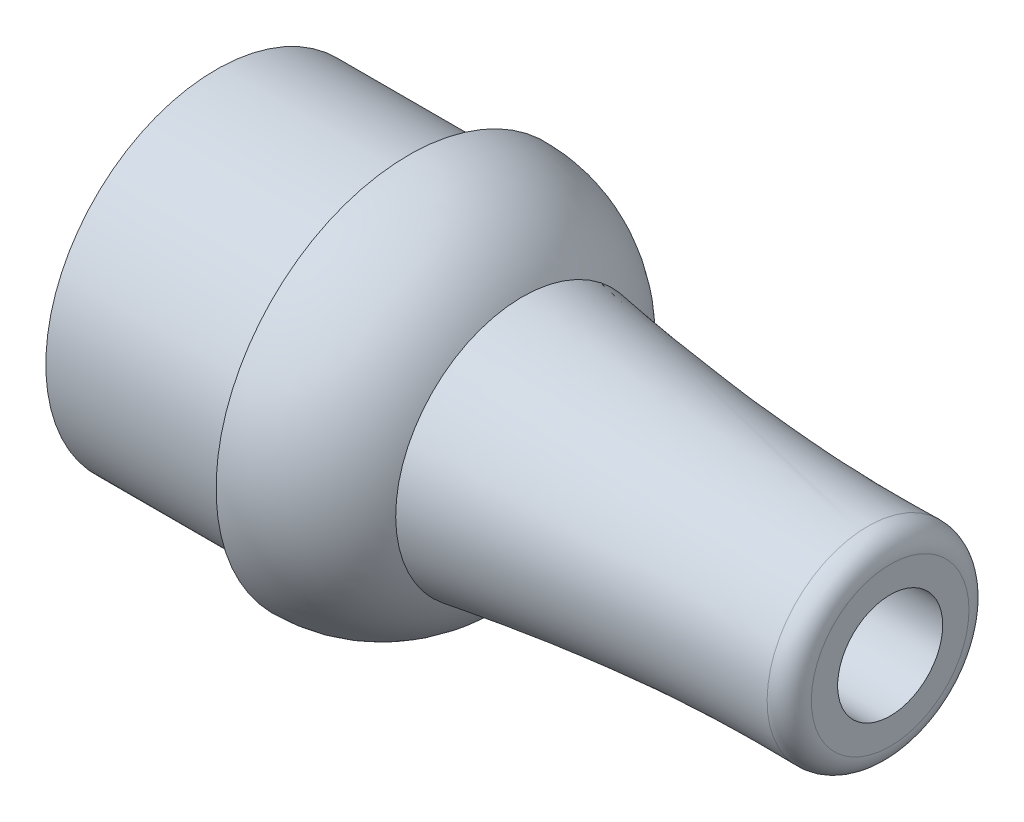
ISO-10303-21;
HEADER;
FILE_DESCRIPTION(('STEP AP214'),'2;1');
FILE_NAME('part.step','',(''),(''),'','','');
FILE_SCHEMA(('AUTOMOTIVE_DESIGN { 1 0 10303 214 1 1 1 1 }'));
ENDSEC;
DATA;
#1=APPLICATION_CONTEXT('core data for automotive mechanical design processes');
#2=APPLICATION_PROTOCOL_DEFINITION('international standard','automotive_design',2000,#1);
#3=PRODUCT_CONTEXT('',#1,'mechanical');
#4=PRODUCT('Part','Part','',(#3));
#5=PRODUCT_RELATED_PRODUCT_CATEGORY('part','',(#4));
#6=PRODUCT_DEFINITION_FORMATION('','',#4);
#7=PRODUCT_DEFINITION_CONTEXT('part definition',#1,'design');
#8=PRODUCT_DEFINITION('design','',#6,#7);
#9=PRODUCT_DEFINITION_SHAPE('','',#8);
#10=(LENGTH_UNIT() NAMED_UNIT(*) SI_UNIT(.MILLI.,.METRE.));
#11=(NAMED_UNIT(*) PLANE_ANGLE_UNIT() SI_UNIT($,.RADIAN.));
#12=(NAMED_UNIT(*) SI_UNIT($,.STERADIAN.) SOLID_ANGLE_UNIT());
#13=UNCERTAINTY_MEASURE_WITH_UNIT(LENGTH_MEASURE(1.E-05),#10,'distance_accuracy_value','');
#14=(GEOMETRIC_REPRESENTATION_CONTEXT(3) GLOBAL_UNCERTAINTY_ASSIGNED_CONTEXT((#13)) GLOBAL_UNIT_ASSIGNED_CONTEXT((#10,
#11,#12)) REPRESENTATION_CONTEXT('',''));
#15=CARTESIAN_POINT('',(0.,0.,0.));
#16=DIRECTION('',(0.,0.,1.));
#17=DIRECTION('',(1.,0.,0.));
#18=AXIS2_PLACEMENT_3D('',#15,#16,#17);
#19=CARTESIAN_POINT('',(4.4,0.,0.));
#20=DIRECTION('',(1.,0.,0.));
#21=DIRECTION('',(0.,0.,-1.));
#22=AXIS2_PLACEMENT_3D('',#19,#20,#21);
#23=DEGENERATE_TOROIDAL_SURFACE('',#22,1.4,3.,.T.);
#24=CARTESIAN_POINT('',(4.4,0.,0.));
#25=DIRECTION('',(1.,0.,0.));
#26=DIRECTION('',(0.,0.,-1.));
#27=AXIS2_PLACEMENT_3D('',#24,#25,#26);
#28=CIRCLE('',#27,4.4);
#29=CARTESIAN_POINT('',(4.4,0.,-4.4));
#30=VERTEX_POINT('',#29);
#31=EDGE_CURVE('E65',#30,#30,#28,.T.);
#32=ORIENTED_EDGE('',*,*,#31,.T.);
#33=EDGE_LOOP('',(#32));
#34=FACE_BOUND('',#33,.T.);
#35=CARTESIAN_POINT('',(7.,0.,0.));
#36=DIRECTION('',(1.,0.,0.));
#37=DIRECTION('',(0.,0.,-1.));
#38=AXIS2_PLACEMENT_3D('',#35,#36,#37);
#39=CIRCLE('',#38,2.89666295470958);
#40=CARTESIAN_POINT('',(7.,2.28098208840173,-1.78543467692809));
#41=VERTEX_POINT('',#40);
#42=EDGE_CURVE('E63',#41,#41,#39,.T.);
#43=ORIENTED_EDGE('',*,*,#42,.F.);
#44=EDGE_LOOP('',(#43));
#45=FACE_BOUND('',#44,.T.);
#46=ADVANCED_FACE('F37',(#34,#45),#23,.T.);
#47=CARTESIAN_POINT('',(4.4,0.,0.));
#48=DIRECTION('',(-1.,0.,0.));
#49=DIRECTION('',(0.,0.,1.));
#50=AXIS2_PLACEMENT_3D('',#47,#48,#49);
#51=CYLINDRICAL_SURFACE('',#50,3.89);
#52=CARTESIAN_POINT('',(4.4,0.,0.));
#53=DIRECTION('',(1.,0.,0.));
#54=DIRECTION('',(0.,0.,-1.));
#55=AXIS2_PLACEMENT_3D('',#52,#53,#54);
#56=CIRCLE('',#55,3.89);
#57=CARTESIAN_POINT('',(4.4,0.,-3.89));
#58=VERTEX_POINT('',#57);
#59=EDGE_CURVE('E48',#58,#58,#56,.T.);
#60=ORIENTED_EDGE('',*,*,#59,.F.);
#61=EDGE_LOOP('',(#60));
#62=FACE_BOUND('',#61,.T.);
#63=CARTESIAN_POINT('',(0.,0.,0.));
#64=DIRECTION('',(1.,0.,0.));
#65=DIRECTION('',(0.,0.,-1.));
#66=AXIS2_PLACEMENT_3D('',#63,#64,#65);
#67=CIRCLE('',#66,3.89);
#68=CARTESIAN_POINT('',(0.,0.,-3.89));
#69=VERTEX_POINT('',#68);
#70=EDGE_CURVE('E52',#69,#69,#67,.T.);
#71=ORIENTED_EDGE('',*,*,#70,.T.);
#72=EDGE_LOOP('',(#71));
#73=FACE_BOUND('',#72,.T.);
#74=ADVANCED_FACE('F94',(#62,#73),#51,.T.);
#75=CARTESIAN_POINT('',(0.,0.,0.));
#76=DIRECTION('',(1.,0.,0.));
#77=DIRECTION('',(0.,0.,-1.));
#78=AXIS2_PLACEMENT_3D('',#75,#76,#77);
#79=PLANE('',#78);
#80=CARTESIAN_POINT('',(0.,0.,0.));
#81=DIRECTION('',(1.,0.,0.));
#82=DIRECTION('',(0.,0.,-1.));
#83=AXIS2_PLACEMENT_3D('',#80,#81,#82);
#84=CIRCLE('',#83,2.9);
#85=CARTESIAN_POINT('',(0.,0.,-2.9));
#86=VERTEX_POINT('',#85);
#87=EDGE_CURVE('E60',#86,#86,#84,.F.);
#88=ORIENTED_EDGE('',*,*,#87,.F.);
#89=EDGE_LOOP('',(#88));
#90=FACE_BOUND('',#89,.T.);
#91=ORIENTED_EDGE('',*,*,#70,.F.);
#92=EDGE_LOOP('',(#91));
#93=FACE_BOUND('',#92,.T.);
#94=ADVANCED_FACE('F89',(#90,#93),#79,.F.);
#95=CARTESIAN_POINT('',(4.4,0.,0.));
#96=DIRECTION('',(1.,0.,0.));
#97=DIRECTION('',(0.,0.,-1.));
#98=AXIS2_PLACEMENT_3D('',#95,#96,#97);
#99=PLANE('',#98);
#100=ORIENTED_EDGE('',*,*,#59,.T.);
#101=EDGE_LOOP('',(#100));
#102=FACE_BOUND('',#101,.T.);
#103=ORIENTED_EDGE('',*,*,#31,.F.);
#104=EDGE_LOOP('',(#103));
#105=FACE_BOUND('',#104,.T.);
#106=ADVANCED_FACE('F81',(#102,#105),#99,.F.);
#107=CARTESIAN_POINT('',(15.4,0.,0.));
#108=DIRECTION('',(1.,0.,0.));
#109=DIRECTION('',(0.,0.,-1.));
#110=AXIS2_PLACEMENT_3D('',#107,#108,#109);
#111=PLANE('',#110);
#112=CARTESIAN_POINT('',(15.4,0.,0.));
#113=DIRECTION('',(1.,0.,0.));
#114=DIRECTION('',(0.,0.,-1.));
#115=AXIS2_PLACEMENT_3D('',#112,#113,#114);
#116=CIRCLE('',#115,1.80062972925942);
#117=CARTESIAN_POINT('',(15.4,0.,-1.80062972925942));
#118=VERTEX_POINT('',#117);
#119=EDGE_CURVE('E44',#118,#118,#116,.T.);
#120=ORIENTED_EDGE('',*,*,#119,.T.);
#121=EDGE_LOOP('',(#120));
#122=FACE_BOUND('',#121,.T.);
#123=CARTESIAN_POINT('',(15.4,0.,0.));
#124=DIRECTION('',(1.,0.,0.));
#125=DIRECTION('',(0.,0.,-1.));
#126=AXIS2_PLACEMENT_3D('',#123,#124,#125);
#127=CIRCLE('',#126,1.2);
#128=CARTESIAN_POINT('',(15.4,0.,-1.2));
#129=VERTEX_POINT('',#128);
#130=EDGE_CURVE('E59',#129,#129,#127,.T.);
#131=ORIENTED_EDGE('',*,*,#130,.F.);
#132=EDGE_LOOP('',(#131));
#133=FACE_BOUND('',#132,.T.);
#134=ADVANCED_FACE('F78',(#122,#133),#111,.T.);
#135=CARTESIAN_POINT('',(15.4,2.29390900318471,0.311779545685909));
#136=CARTESIAN_POINT('',(7.,2.28098208840173,-1.78543467692809));
#137=CARTESIAN_POINT('',(15.4,2.91746809455653,-4.27603846068352));
#138=CARTESIAN_POINT('',(7.,-1.28988726545445,-6.34739885373154));
#139=CARTESIAN_POINT('',(15.4,-1.6703499118129,-4.89959755205534));
#140=CARTESIAN_POINT('',(7.,-5.85185144225791,-2.77652949987536));
#141=CARTESIAN_POINT('',(15.4,-2.29390900318471,-0.311779545685909));
#142=CARTESIAN_POINT('',(7.,-2.28098208840173,1.78543467692809));
#143=CARTESIAN_POINT('',(15.4,-2.91746809455653,4.27603846068352));
#144=CARTESIAN_POINT('',(7.,1.28988726545445,6.34739885373154));
#145=CARTESIAN_POINT('',(15.4,1.6703499118129,4.89959755205534));
#146=CARTESIAN_POINT('',(7.,5.85185144225791,2.77652949987536));
#147=CARTESIAN_POINT('',(15.4,2.29390900318471,0.311779545685909));
#148=CARTESIAN_POINT('',(7.,2.28098208840173,-1.78543467692809));
#149=(BOUNDED_SURFACE() B_SPLINE_SURFACE(3,1,((#135,#136),(#137,#138),(#139,#140),(#141,#142),
(#143,#144),(#145,#146),(#147,#148)),.UNSPECIFIED.,.T.,.F.,.F.) B_SPLINE_SURFACE_WITH_KNOTS((4,
3,4),(2,2),(0.,0.5,1.),(0.,1.),
.UNSPECIFIED.) GEOMETRIC_REPRESENTATION_ITEM() RATIONAL_B_SPLINE_SURFACE(((1.,1.),
(0.333333333333333,0.333333333333333),(0.333333333333333,0.333333333333333),(1.,1.),
(0.333333333333333,0.333333333333333),(0.333333333333333,0.333333333333333),(1.,1.))) REPRESENTATION_ITEM('') SURFACE());
#150=CARTESIAN_POINT('',(14.8892369937302,0.,0.));
#151=DIRECTION('',(-1.,0.,0.));
#152=DIRECTION('',(0.,0.,1.));
#153=AXIS2_PLACEMENT_3D('',#150,#151,#152);
#154=CIRCLE('',#153,2.3005138735329);
#155=CARTESIAN_POINT('',(14.8892369937302,2.29312298058277,0.184258183646125));
#156=VERTEX_POINT('',#155);
#157=EDGE_CURVE('E11',#156,#156,#154,.T.);
#158=CARTESIAN_POINT('',(14.8892369937302,2.29312298058277,0.184258183646125));
#159=CARTESIAN_POINT('',(14.8070574417121,2.29299651295588,0.16374054968181));
#160=CARTESIAN_POINT('',(14.7248778896941,2.292870045329,0.143222915717496));
#161=CARTESIAN_POINT('',(14.5605187856581,2.29261711007522,0.102187647788866));
#162=CARTESIAN_POINT('',(14.4783392336401,2.29249064244834,0.0816700138245517));
#163=CARTESIAN_POINT('',(14.313980129604,2.29223770719457,0.0406347458959222));
#164=CARTESIAN_POINT('',(14.231800577586,2.29211123956768,0.0201171119316073));
#165=CARTESIAN_POINT('',(14.0674414735499,2.29185830431391,-0.0209181559970222));
#166=CARTESIAN_POINT('',(13.9852619215319,2.29173183668702,-0.0414357899613369));
#167=CARTESIAN_POINT('',(13.8209028174959,2.29147890143325,-0.0824710578899664));
#168=CARTESIAN_POINT('',(13.7387232654778,2.29135243380637,-0.102988691854281));
#169=CARTESIAN_POINT('',(13.5743641614418,2.29109949855259,-0.144023959782911));
#170=CARTESIAN_POINT('',(13.4921846094238,2.29097303092571,-0.164541593747225));
#171=CARTESIAN_POINT('',(13.3278255053877,2.29072009567194,-0.205576861675855));
#172=CARTESIAN_POINT('',(13.2456459533697,2.29059362804505,-0.22609449564017));
#173=CARTESIAN_POINT('',(13.0812868493337,2.29034069279128,-0.267129763568799));
#174=CARTESIAN_POINT('',(12.9991072973156,2.29021422516439,-0.287647397533114));
#175=CARTESIAN_POINT('',(12.8347481932796,2.28996128991062,-0.328682665461743));
#176=CARTESIAN_POINT('',(12.7525686412616,2.28983482228374,-0.349200299426058));
#177=CARTESIAN_POINT('',(12.5882095372255,2.28958188702996,-0.390235567354688));
#178=CARTESIAN_POINT('',(12.5060299852075,2.28945541940308,-0.410753201319002));
#179=CARTESIAN_POINT('',(12.3416708811715,2.28920248414931,-0.451788469247632));
#180=CARTESIAN_POINT('',(12.2594913291534,2.28907601652242,-0.472306103211946));
#181=CARTESIAN_POINT('',(12.0951322251174,2.28882308126865,-0.513341371140576));
#182=CARTESIAN_POINT('',(12.0129526730994,2.28869661364176,-0.533859005104891));
#183=CARTESIAN_POINT('',(11.8485935690633,2.28844367838799,-0.57489427303352));
#184=CARTESIAN_POINT('',(11.7664140170453,2.28831721076111,-0.595411906997835));
#185=CARTESIAN_POINT('',(11.6020549130093,2.28806427550733,-0.636447174926464));
#186=CARTESIAN_POINT('',(11.5198753609912,2.28793780788045,-0.656964808890779));
#187=CARTESIAN_POINT('',(11.3555162569552,2.28768487262668,-0.698000076819409));
#188=CARTESIAN_POINT('',(11.2733367049372,2.28755840499979,-0.718517710783723));
#189=CARTESIAN_POINT('',(11.1089776009011,2.28730546974602,-0.759552978712353));
#190=CARTESIAN_POINT('',(11.0267980488831,2.28717900211913,-0.780070612676668));
#191=CARTESIAN_POINT('',(10.8624389448471,2.28692606686536,-0.821105880605297));
#192=CARTESIAN_POINT('',(10.780259392829,2.28679959923848,-0.841623514569612));
#193=CARTESIAN_POINT('',(10.615900288793,2.2865466639847,-0.882658782498241));
#194=CARTESIAN_POINT('',(10.533720736775,2.28642019635782,-0.903176416462556));
#195=CARTESIAN_POINT('',(10.3693616327389,2.28616726110405,-0.944211684391185));
#196=CARTESIAN_POINT('',(10.2871820807209,2.28604079347716,-0.9647293183555));
#197=CARTESIAN_POINT('',(10.1228229766849,2.28578785822339,-1.00576458628413));
#198=CARTESIAN_POINT('',(10.0406434246668,2.2856613905965,-1.02628222024844));
#199=CARTESIAN_POINT('',(9.87628432063079,2.28540845534273,-1.06731748817707));
#200=CARTESIAN_POINT('',(9.79410476861277,2.28528198771585,-1.08783512214139));
#201=CARTESIAN_POINT('',(9.62974566457672,2.28502905246207,-1.12887039007002));
#202=CARTESIAN_POINT('',(9.5475661125587,2.28490258483519,-1.14938802403433));
#203=CARTESIAN_POINT('',(9.38320700852265,2.28464964958142,-1.19042329196296));
#204=CARTESIAN_POINT('',(9.30102745650463,2.28452318195453,-1.21094092592728));
#205=CARTESIAN_POINT('',(9.13666835246859,2.28427024670076,-1.25197619385591));
#206=CARTESIAN_POINT('',(9.05448880045056,2.28414377907387,-1.27249382782022));
#207=CARTESIAN_POINT('',(8.89012969641452,2.2838908438201,-1.31352909574885));
#208=CARTESIAN_POINT('',(8.80795014439649,2.28376437619321,-1.33404672971317));
#209=CARTESIAN_POINT('',(8.64359104036045,2.28351144093944,-1.37508199764179));
#210=CARTESIAN_POINT('',(8.56141148834243,2.28338497331256,-1.39559963160611));
#211=CARTESIAN_POINT('',(8.39705238430638,2.28313203805879,-1.43663489953474));
#212=CARTESIAN_POINT('',(8.31487283228836,2.2830055704319,-1.45715253349905));
#213=CARTESIAN_POINT('',(8.15051372825232,2.28275263517813,-1.49818780142768));
#214=CARTESIAN_POINT('',(8.06833417623429,2.28262616755124,-1.518705435392));
#215=CARTESIAN_POINT('',(7.90397507219825,2.28237323229747,-1.55974070332063));
#216=CARTESIAN_POINT('',(7.82179552018023,2.28224676467059,-1.58025833728494));
#217=CARTESIAN_POINT('',(7.65743641614418,2.28199382941681,-1.62129360521357));
#218=CARTESIAN_POINT('',(7.57525686412616,2.28186736178993,-1.64181123917789));
#219=CARTESIAN_POINT('',(7.41089776009011,2.28161442653616,-1.68284650710652));
#220=CARTESIAN_POINT('',(7.32871820807209,2.28148795890927,-1.70336414107083));
#221=CARTESIAN_POINT('',(7.16435910403605,2.2812350236555,-1.74439940899946));
#222=CARTESIAN_POINT('',(7.08217955201802,2.28110855602861,-1.76491704296377));
#223=CARTESIAN_POINT('',(7.,2.28098208840173,-1.78543467692809));
#224=B_SPLINE_CURVE_WITH_KNOTS('',3,(#158,#159,#160,#161,#162,#163,#164,#165,#166,#167,#168,
#169,#170,#171,#172,#173,#174,#175,#176,#177,#178,#179,#180,#181,#182,#183,#184,#185,#186,#187,
#188,#189,#190,#191,#192,#193,#194,#195,#196,#197,#198,#199,#200,#201,#202,#203,#204,#205,#206,
#207,#208,#209,#210,#211,#212,#213,#214,#215,#216,#217,#218,#219,#220,#221,#222,#223),
.UNSPECIFIED.,.F.,.F.,(4,2,2,2,2,2,2,2,2,2,2,2,2,2,2,2,2,2,2,2,2,2,2,2,2,2,2,2,2,2,2,2,4),(0.,
0.254106695320949,0.508213390641899,0.762320085962848,1.0164267812838,1.27053347660475,
1.5246401719257,1.77874686724665,2.0328535625676,2.28696025788855,2.5410669532095,
2.79517364853045,3.0492803438514,3.30338703917235,3.5574937344933,3.81160042981425,
4.0657071251352,4.31981382045615,4.5739205157771,4.82802721109805,5.082133906419,
5.33624060173995,5.5903472970609,5.84445399238185,6.0985606877028,6.35266738302375,
6.6067740783447,6.86088077366565,7.1149874689866,7.36909416430755,7.6232008596285,
7.87730755494945,8.1314142502704),.UNSPECIFIED.);
#225=EDGE_CURVE('BSEAM80',#156,#41,#224,.T.);
#226=ORIENTED_EDGE('',*,*,#157,.T.);
#227=ORIENTED_EDGE('',*,*,#42,.T.);
#228=ORIENTED_EDGE('',*,*,#225,.T.);
#229=ORIENTED_EDGE('',*,*,#225,.F.);
#230=EDGE_LOOP('',(#226,#228,#227,#229));
#231=FACE_BOUND('',#230,.T.);
#232=ADVANCED_FACE('F80',(#231),#149,.T.);
#233=CARTESIAN_POINT('',(-1.2E-05,0.,0.));
#234=DIRECTION('',(1.,0.,0.));
#235=DIRECTION('',(0.,0.,-1.));
#236=AXIS2_PLACEMENT_3D('',#233,#234,#235);
#237=CYLINDRICAL_SURFACE('',#236,2.9);
#238=CARTESIAN_POINT('',(6.,0.,0.));
#239=DIRECTION('',(-1.,0.,0.));
#240=DIRECTION('',(0.,0.,1.));
#241=AXIS2_PLACEMENT_3D('',#238,#239,#240);
#242=CIRCLE('',#241,2.9);
#243=CARTESIAN_POINT('',(6.,0.,-2.9));
#244=VERTEX_POINT('',#243);
#245=EDGE_CURVE('E58',#244,#244,#242,.T.);
#246=CARTESIAN_POINT('',(6.,0.,-2.9));
#247=CARTESIAN_POINT('',(5.9375,0.,-2.9));
#248=CARTESIAN_POINT('',(5.875,0.,-2.9));
#249=CARTESIAN_POINT('',(5.75,0.,-2.9));
#250=CARTESIAN_POINT('',(5.6875,0.,-2.9));
#251=CARTESIAN_POINT('',(5.5625,0.,-2.9));
#252=CARTESIAN_POINT('',(5.5,0.,-2.9));
#253=CARTESIAN_POINT('',(5.375,0.,-2.9));
#254=CARTESIAN_POINT('',(5.3125,0.,-2.9));
#255=CARTESIAN_POINT('',(5.1875,0.,-2.9));
#256=CARTESIAN_POINT('',(5.125,0.,-2.9));
#257=CARTESIAN_POINT('',(5.,0.,-2.9));
#258=CARTESIAN_POINT('',(4.9375,0.,-2.9));
#259=CARTESIAN_POINT('',(4.8125,0.,-2.9));
#260=CARTESIAN_POINT('',(4.75,0.,-2.9));
#261=CARTESIAN_POINT('',(4.625,0.,-2.9));
#262=CARTESIAN_POINT('',(4.5625,0.,-2.9));
#263=CARTESIAN_POINT('',(4.4375,0.,-2.9));
#264=CARTESIAN_POINT('',(4.375,0.,-2.9));
#265=CARTESIAN_POINT('',(4.25,0.,-2.9));
#266=CARTESIAN_POINT('',(4.1875,0.,-2.9));
#267=CARTESIAN_POINT('',(4.0625,0.,-2.9));
#268=CARTESIAN_POINT('',(4.,0.,-2.9));
#269=CARTESIAN_POINT('',(3.875,0.,-2.9));
#270=CARTESIAN_POINT('',(3.8125,0.,-2.9));
#271=CARTESIAN_POINT('',(3.6875,0.,-2.9));
#272=CARTESIAN_POINT('',(3.625,0.,-2.9));
#273=CARTESIAN_POINT('',(3.5,0.,-2.9));
#274=CARTESIAN_POINT('',(3.4375,0.,-2.9));
#275=CARTESIAN_POINT('',(3.3125,0.,-2.9));
#276=CARTESIAN_POINT('',(3.25,0.,-2.9));
#277=CARTESIAN_POINT('',(3.125,0.,-2.9));
#278=CARTESIAN_POINT('',(3.0625,0.,-2.9));
#279=CARTESIAN_POINT('',(2.9375,0.,-2.9));
#280=CARTESIAN_POINT('',(2.875,0.,-2.9));
#281=CARTESIAN_POINT('',(2.75,0.,-2.9));
#282=CARTESIAN_POINT('',(2.6875,0.,-2.9));
#283=CARTESIAN_POINT('',(2.5625,0.,-2.9));
#284=CARTESIAN_POINT('',(2.5,0.,-2.9));
#285=CARTESIAN_POINT('',(2.375,0.,-2.9));
#286=CARTESIAN_POINT('',(2.3125,0.,-2.9));
#287=CARTESIAN_POINT('',(2.1875,0.,-2.9));
#288=CARTESIAN_POINT('',(2.125,0.,-2.9));
#289=CARTESIAN_POINT('',(2.,0.,-2.9));
#290=CARTESIAN_POINT('',(1.9375,0.,-2.9));
#291=CARTESIAN_POINT('',(1.8125,0.,-2.9));
#292=CARTESIAN_POINT('',(1.75,0.,-2.9));
#293=CARTESIAN_POINT('',(1.625,0.,-2.9));
#294=CARTESIAN_POINT('',(1.5625,0.,-2.9));
#295=CARTESIAN_POINT('',(1.4375,0.,-2.9));
#296=CARTESIAN_POINT('',(1.375,0.,-2.9));
#297=CARTESIAN_POINT('',(1.25,0.,-2.9));
#298=CARTESIAN_POINT('',(1.1875,0.,-2.9));
#299=CARTESIAN_POINT('',(1.0625,0.,-2.9));
#300=CARTESIAN_POINT('',(1.,0.,-2.9));
#301=CARTESIAN_POINT('',(0.875,0.,-2.9));
#302=CARTESIAN_POINT('',(0.8125,0.,-2.9));
#303=CARTESIAN_POINT('',(0.6875,0.,-2.9));
#304=CARTESIAN_POINT('',(0.625,0.,-2.9));
#305=CARTESIAN_POINT('',(0.5,0.,-2.9));
#306=CARTESIAN_POINT('',(0.4375,0.,-2.9));
#307=CARTESIAN_POINT('',(0.3125,0.,-2.9));
#308=CARTESIAN_POINT('',(0.25,0.,-2.9));
#309=CARTESIAN_POINT('',(0.125,0.,-2.9));
#310=CARTESIAN_POINT('',(0.0624999999999999,0.,-2.9));
#311=CARTESIAN_POINT('',(0.,0.,-2.9));
#312=B_SPLINE_CURVE_WITH_KNOTS('',3,(#246,#247,#248,#249,#250,#251,#252,#253,#254,#255,#256,
#257,#258,#259,#260,#261,#262,#263,#264,#265,#266,#267,#268,#269,#270,#271,#272,#273,#274,#275,
#276,#277,#278,#279,#280,#281,#282,#283,#284,#285,#286,#287,#288,#289,#290,#291,#292,#293,#294,
#295,#296,#297,#298,#299,#300,#301,#302,#303,#304,#305,#306,#307,#308,#309,#310,#311),
.UNSPECIFIED.,.F.,.F.,(4,2,2,2,2,2,2,2,2,2,2,2,2,2,2,2,2,2,2,2,2,2,2,2,2,2,2,2,2,2,2,2,4),(0.,
0.1875,0.375,0.5625,0.75,0.9375,1.125,1.3125,1.5,1.6875,1.875,2.0625,2.25,2.4375,2.625,2.8125,
3.,3.1875,3.375,3.5625,3.75,3.9375,4.125,4.3125,4.5,4.6875,4.875,5.0625,5.25,5.4375,5.625,
5.8125,6.),.UNSPECIFIED.);
#313=EDGE_CURVE('BSEAM87',#244,#86,#312,.T.);
#314=ORIENTED_EDGE('',*,*,#245,.F.);
#315=ORIENTED_EDGE('',*,*,#87,.T.);
#316=ORIENTED_EDGE('',*,*,#313,.T.);
#317=ORIENTED_EDGE('',*,*,#313,.F.);
#318=EDGE_LOOP('',(#314,#316,#315,#317));
#319=FACE_BOUND('',#318,.T.);
#320=ADVANCED_FACE('F87',(#319),#237,.F.);
#321=CARTESIAN_POINT('',(6.,0.,0.));
#322=DIRECTION('',(-1.,0.,0.));
#323=DIRECTION('',(0.,0.,1.));
#324=AXIS2_PLACEMENT_3D('',#321,#322,#323);
#325=PLANE('',#324);
#326=CARTESIAN_POINT('',(6.,0.,0.));
#327=DIRECTION('',(-1.,0.,0.));
#328=DIRECTION('',(0.,0.,1.));
#329=AXIS2_PLACEMENT_3D('',#326,#327,#328);
#330=CIRCLE('',#329,1.2);
#331=CARTESIAN_POINT('',(6.,0.,-1.2));
#332=VERTEX_POINT('',#331);
#333=EDGE_CURVE('E55',#332,#332,#330,.T.);
#334=ORIENTED_EDGE('',*,*,#333,.F.);
#335=EDGE_LOOP('',(#334));
#336=FACE_BOUND('',#335,.T.);
#337=ORIENTED_EDGE('',*,*,#245,.T.);
#338=EDGE_LOOP('',(#337));
#339=FACE_BOUND('',#338,.T.);
#340=ADVANCED_FACE('F120',(#336,#339),#325,.T.);
#341=CARTESIAN_POINT('',(0.,0.,0.));
#342=DIRECTION('',(1.,0.,0.));
#343=DIRECTION('',(0.,0.,-1.));
#344=AXIS2_PLACEMENT_3D('',#341,#342,#343);
#345=CYLINDRICAL_SURFACE('',#344,1.2);
#346=CARTESIAN_POINT('',(6.,0.,-1.2));
#347=CARTESIAN_POINT('',(6.09791666666667,0.,-1.2));
#348=CARTESIAN_POINT('',(6.19583333333333,0.,-1.2));
#349=CARTESIAN_POINT('',(6.39166666666667,0.,-1.2));
#350=CARTESIAN_POINT('',(6.48958333333333,0.,-1.2));
#351=CARTESIAN_POINT('',(6.68541666666667,0.,-1.2));
#352=CARTESIAN_POINT('',(6.78333333333333,0.,-1.2));
#353=CARTESIAN_POINT('',(6.97916666666667,0.,-1.2));
#354=CARTESIAN_POINT('',(7.07708333333333,0.,-1.2));
#355=CARTESIAN_POINT('',(7.27291666666667,0.,-1.2));
#356=CARTESIAN_POINT('',(7.37083333333333,0.,-1.2));
#357=CARTESIAN_POINT('',(7.56666666666667,0.,-1.2));
#358=CARTESIAN_POINT('',(7.66458333333333,0.,-1.2));
#359=CARTESIAN_POINT('',(7.86041666666667,0.,-1.2));
#360=CARTESIAN_POINT('',(7.95833333333333,0.,-1.2));
#361=CARTESIAN_POINT('',(8.15416666666667,0.,-1.2));
#362=CARTESIAN_POINT('',(8.25208333333333,0.,-1.2));
#363=CARTESIAN_POINT('',(8.44791666666667,0.,-1.2));
#364=CARTESIAN_POINT('',(8.54583333333333,0.,-1.2));
#365=CARTESIAN_POINT('',(8.74166666666667,0.,-1.2));
#366=CARTESIAN_POINT('',(8.83958333333333,0.,-1.2));
#367=CARTESIAN_POINT('',(9.03541666666667,0.,-1.2));
#368=CARTESIAN_POINT('',(9.13333333333333,0.,-1.2));
#369=CARTESIAN_POINT('',(9.32916666666667,0.,-1.2));
#370=CARTESIAN_POINT('',(9.42708333333333,0.,-1.2));
#371=CARTESIAN_POINT('',(9.62291666666667,0.,-1.2));
#372=CARTESIAN_POINT('',(9.72083333333333,0.,-1.2));
#373=CARTESIAN_POINT('',(9.91666666666667,0.,-1.2));
#374=CARTESIAN_POINT('',(10.0145833333333,0.,-1.2));
#375=CARTESIAN_POINT('',(10.2104166666667,0.,-1.2));
#376=CARTESIAN_POINT('',(10.3083333333333,0.,-1.2));
#377=CARTESIAN_POINT('',(10.5041666666667,0.,-1.2));
#378=CARTESIAN_POINT('',(10.6020833333333,0.,-1.2));
#379=CARTESIAN_POINT('',(10.7979166666667,0.,-1.2));
#380=CARTESIAN_POINT('',(10.8958333333333,0.,-1.2));
#381=CARTESIAN_POINT('',(11.0916666666667,0.,-1.2));
#382=CARTESIAN_POINT('',(11.1895833333333,0.,-1.2));
#383=CARTESIAN_POINT('',(11.3854166666667,0.,-1.2));
#384=CARTESIAN_POINT('',(11.4833333333333,0.,-1.2));
#385=CARTESIAN_POINT('',(11.6791666666667,0.,-1.2));
#386=CARTESIAN_POINT('',(11.7770833333333,0.,-1.2));
#387=CARTESIAN_POINT('',(11.9729166666667,0.,-1.2));
#388=CARTESIAN_POINT('',(12.0708333333333,0.,-1.2));
#389=CARTESIAN_POINT('',(12.2666666666667,0.,-1.2));
#390=CARTESIAN_POINT('',(12.3645833333333,0.,-1.2));
#391=CARTESIAN_POINT('',(12.5604166666667,0.,-1.2));
#392=CARTESIAN_POINT('',(12.6583333333333,0.,-1.2));
#393=CARTESIAN_POINT('',(12.8541666666667,0.,-1.2));
#394=CARTESIAN_POINT('',(12.9520833333333,0.,-1.2));
#395=CARTESIAN_POINT('',(13.1479166666667,0.,-1.2));
#396=CARTESIAN_POINT('',(13.2458333333333,0.,-1.2));
#397=CARTESIAN_POINT('',(13.4416666666667,0.,-1.2));
#398=CARTESIAN_POINT('',(13.5395833333333,0.,-1.2));
#399=CARTESIAN_POINT('',(13.7354166666667,0.,-1.2));
#400=CARTESIAN_POINT('',(13.8333333333333,0.,-1.2));
#401=CARTESIAN_POINT('',(14.0291666666667,0.,-1.2));
#402=CARTESIAN_POINT('',(14.1270833333333,0.,-1.2));
#403=CARTESIAN_POINT('',(14.3229166666667,0.,-1.2));
#404=CARTESIAN_POINT('',(14.4208333333333,0.,-1.2));
#405=CARTESIAN_POINT('',(14.6166666666667,0.,-1.2));
#406=CARTESIAN_POINT('',(14.7145833333333,0.,-1.2));
#407=CARTESIAN_POINT('',(14.9104166666667,0.,-1.2));
#408=CARTESIAN_POINT('',(15.0083333333333,0.,-1.2));
#409=CARTESIAN_POINT('',(15.2041666666667,0.,-1.2));
#410=CARTESIAN_POINT('',(15.3020833333333,0.,-1.2));
#411=CARTESIAN_POINT('',(15.4,0.,-1.2));
#412=B_SPLINE_CURVE_WITH_KNOTS('',3,(#346,#347,#348,#349,#350,#351,#352,#353,#354,#355,#356,
#357,#358,#359,#360,#361,#362,#363,#364,#365,#366,#367,#368,#369,#370,#371,#372,#373,#374,#375,
#376,#377,#378,#379,#380,#381,#382,#383,#384,#385,#386,#387,#388,#389,#390,#391,#392,#393,#394,
#395,#396,#397,#398,#399,#400,#401,#402,#403,#404,#405,#406,#407,#408,#409,#410,#411),
.UNSPECIFIED.,.F.,.F.,(4,2,2,2,2,2,2,2,2,2,2,2,2,2,2,2,2,2,2,2,2,2,2,2,2,2,2,2,2,2,2,2,4),(0.,
0.29375,0.587499999999999,0.88125,1.175,1.46875,1.7625,2.05625,2.35,2.64375,2.9375,3.23125,
3.525,3.81875,4.1125,4.40625,4.7,4.99375,5.2875,5.58125,5.875,6.16875,6.4625,6.75625,7.05,
7.34375,7.6375,7.93125,8.225,8.51875,8.8125,9.10625,9.4),.UNSPECIFIED.);
#413=EDGE_CURVE('BSEAM76',#332,#129,#412,.T.);
#414=ORIENTED_EDGE('',*,*,#333,.T.);
#415=ORIENTED_EDGE('',*,*,#130,.T.);
#416=ORIENTED_EDGE('',*,*,#413,.T.);
#417=ORIENTED_EDGE('',*,*,#413,.F.);
#418=EDGE_LOOP('',(#414,#416,#415,#417));
#419=FACE_BOUND('',#418,.T.);
#420=ADVANCED_FACE('F76',(#419),#345,.F.);
#421=CARTESIAN_POINT('',(14.9,0.,0.));
#422=DIRECTION('',(-1.,0.,0.));
#423=DIRECTION('',(0.,0.,1.));
#424=AXIS2_PLACEMENT_3D('',#421,#422,#423);
#425=TOROIDAL_SURFACE('',#424,1.80062972925942,0.5);
#426=ORIENTED_EDGE('',*,*,#157,.F.);
#427=EDGE_LOOP('',(#426));
#428=FACE_BOUND('',#427,.T.);
#429=ORIENTED_EDGE('',*,*,#119,.F.);
#430=EDGE_LOOP('',(#429));
#431=FACE_BOUND('',#430,.T.);
#432=ADVANCED_FACE('F39',(#428,#431),#425,.T.);
#433=CLOSED_SHELL('',(#46,#74,#94,#106,#134,#232,#320,#340,#420,#432));
#434=MANIFOLD_SOLID_BREP('B2',#433);
#435=ADVANCED_BREP_SHAPE_REPRESENTATION('',(#18,#434),#14);
#436=SHAPE_DEFINITION_REPRESENTATION(#9,#435);
ENDSEC;
END-ISO-10303-21;
